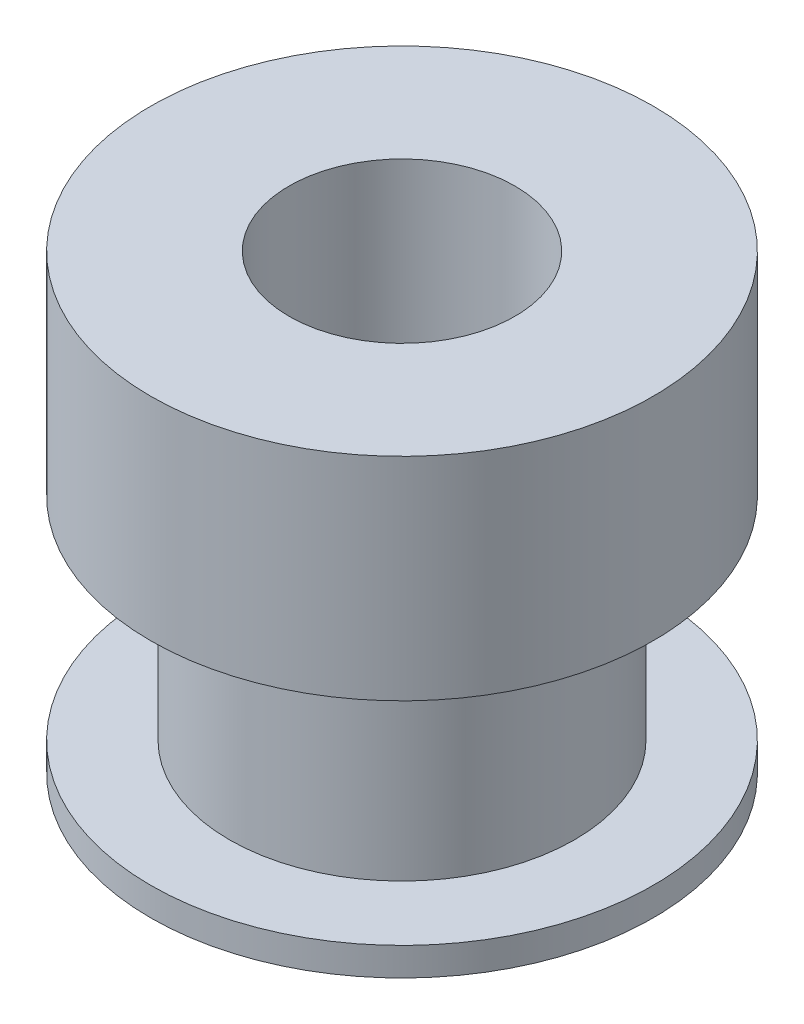
ISO-10303-21;
HEADER;
FILE_DESCRIPTION(('STEP AP214'),'2;1');
FILE_NAME('part.step','',(''),(''),'','','');
FILE_SCHEMA(('AUTOMOTIVE_DESIGN { 1 0 10303 214 1 1 1 1 }'));
ENDSEC;
DATA;
#1=APPLICATION_CONTEXT('core data for automotive mechanical design processes');
#2=APPLICATION_PROTOCOL_DEFINITION('international standard','automotive_design',2000,#1);
#3=PRODUCT_CONTEXT('',#1,'mechanical');
#4=PRODUCT('Part','Part','',(#3));
#5=PRODUCT_RELATED_PRODUCT_CATEGORY('part','',(#4));
#6=PRODUCT_DEFINITION_FORMATION('','',#4);
#7=PRODUCT_DEFINITION_CONTEXT('part definition',#1,'design');
#8=PRODUCT_DEFINITION('design','',#6,#7);
#9=PRODUCT_DEFINITION_SHAPE('','',#8);
#10=(LENGTH_UNIT() NAMED_UNIT(*) SI_UNIT(.MILLI.,.METRE.));
#11=(NAMED_UNIT(*) PLANE_ANGLE_UNIT() SI_UNIT($,.RADIAN.));
#12=(NAMED_UNIT(*) SI_UNIT($,.STERADIAN.) SOLID_ANGLE_UNIT());
#13=UNCERTAINTY_MEASURE_WITH_UNIT(LENGTH_MEASURE(1.E-05),#10,'distance_accuracy_value','');
#14=(GEOMETRIC_REPRESENTATION_CONTEXT(3) GLOBAL_UNCERTAINTY_ASSIGNED_CONTEXT((#13)) GLOBAL_UNIT_ASSIGNED_CONTEXT((#10,
#11,#12)) REPRESENTATION_CONTEXT('',''));
#15=CARTESIAN_POINT('',(0.,0.,0.));
#16=DIRECTION('',(0.,0.,1.));
#17=DIRECTION('',(1.,0.,0.));
#18=AXIS2_PLACEMENT_3D('',#15,#16,#17);
#19=CARTESIAN_POINT('',(0.,0.,0.));
#20=DIRECTION('',(0.,-1.,0.));
#21=DIRECTION('',(0.,0.,-1.));
#22=AXIS2_PLACEMENT_3D('',#19,#20,#21);
#23=CYLINDRICAL_SURFACE('',#22,4.);
#24=CARTESIAN_POINT('',(0.,0.,0.));
#25=DIRECTION('',(0.,-1.,0.));
#26=DIRECTION('',(0.,0.,-1.));
#27=AXIS2_PLACEMENT_3D('',#24,#25,#26);
#28=CIRCLE('',#27,4.);
#29=CARTESIAN_POINT('',(0.,0.,-4.));
#30=VERTEX_POINT('',#29);
#31=EDGE_CURVE('E10',#30,#30,#28,.T.);
#32=ORIENTED_EDGE('',*,*,#31,.T.);
#33=EDGE_LOOP('',(#32));
#34=FACE_BOUND('',#33,.T.);
#35=CARTESIAN_POINT('',(0.,16.,0.));
#36=DIRECTION('',(0.,-1.,0.));
#37=DIRECTION('',(0.,0.,-1.));
#38=AXIS2_PLACEMENT_3D('',#35,#36,#37);
#39=CIRCLE('',#38,4.);
#40=CARTESIAN_POINT('',(0.,16.,-4.));
#41=VERTEX_POINT('',#40);
#42=EDGE_CURVE('E58',#41,#41,#39,.T.);
#43=ORIENTED_EDGE('',*,*,#42,.F.);
#44=EDGE_LOOP('',(#43));
#45=FACE_BOUND('',#44,.T.);
#46=ADVANCED_FACE('F30',(#34,#45),#23,.F.);
#47=CARTESIAN_POINT('',(4.,0.,0.));
#48=DIRECTION('',(0.,-1.,0.));
#49=DIRECTION('',(0.,0.,-1.));
#50=AXIS2_PLACEMENT_3D('',#47,#48,#49);
#51=PLANE('',#50);
#52=CARTESIAN_POINT('',(0.,0.,0.));
#53=DIRECTION('',(0.,-1.,0.));
#54=DIRECTION('',(0.,0.,-1.));
#55=AXIS2_PLACEMENT_3D('',#52,#53,#54);
#56=CIRCLE('',#55,8.9);
#57=CARTESIAN_POINT('',(0.,0.,-8.9));
#58=VERTEX_POINT('',#57);
#59=EDGE_CURVE('E36',#58,#58,#56,.T.);
#60=ORIENTED_EDGE('',*,*,#59,.T.);
#61=EDGE_LOOP('',(#60));
#62=FACE_BOUND('',#61,.T.);
#63=ORIENTED_EDGE('',*,*,#31,.F.);
#64=EDGE_LOOP('',(#63));
#65=FACE_BOUND('',#64,.T.);
#66=ADVANCED_FACE('F66',(#62,#65),#51,.T.);
#67=CARTESIAN_POINT('',(0.,0.,0.));
#68=DIRECTION('',(0.,-1.,0.));
#69=DIRECTION('',(0.,0.,-1.));
#70=AXIS2_PLACEMENT_3D('',#67,#68,#69);
#71=CYLINDRICAL_SURFACE('',#70,8.9);
#72=CARTESIAN_POINT('',(0.,1.,0.));
#73=DIRECTION('',(0.,-1.,0.));
#74=DIRECTION('',(0.,0.,-1.));
#75=AXIS2_PLACEMENT_3D('',#72,#73,#74);
#76=CIRCLE('',#75,8.9);
#77=CARTESIAN_POINT('',(0.,1.,-8.9));
#78=VERTEX_POINT('',#77);
#79=EDGE_CURVE('E40',#78,#78,#76,.T.);
#80=ORIENTED_EDGE('',*,*,#79,.T.);
#81=EDGE_LOOP('',(#80));
#82=FACE_BOUND('',#81,.T.);
#83=ORIENTED_EDGE('',*,*,#59,.F.);
#84=EDGE_LOOP('',(#83));
#85=FACE_BOUND('',#84,.T.);
#86=ADVANCED_FACE('F70',(#82,#85),#71,.T.);
#87=CARTESIAN_POINT('',(8.9,1.,0.));
#88=DIRECTION('',(0.,1.,0.));
#89=DIRECTION('',(0.,0.,1.));
#90=AXIS2_PLACEMENT_3D('',#87,#88,#89);
#91=PLANE('',#90);
#92=CARTESIAN_POINT('',(0.,1.,0.));
#93=DIRECTION('',(0.,-1.,0.));
#94=DIRECTION('',(0.,0.,-1.));
#95=AXIS2_PLACEMENT_3D('',#92,#93,#94);
#96=CIRCLE('',#95,6.11);
#97=CARTESIAN_POINT('',(0.,1.,-6.11));
#98=VERTEX_POINT('',#97);
#99=EDGE_CURVE('E44',#98,#98,#96,.T.);
#100=ORIENTED_EDGE('',*,*,#99,.T.);
#101=EDGE_LOOP('',(#100));
#102=FACE_BOUND('',#101,.T.);
#103=ORIENTED_EDGE('',*,*,#79,.F.);
#104=EDGE_LOOP('',(#103));
#105=FACE_BOUND('',#104,.T.);
#106=ADVANCED_FACE('F74',(#102,#105),#91,.T.);
#107=CARTESIAN_POINT('',(0.,0.,0.));
#108=DIRECTION('',(0.,-1.,0.));
#109=DIRECTION('',(0.,0.,-1.));
#110=AXIS2_PLACEMENT_3D('',#107,#108,#109);
#111=CYLINDRICAL_SURFACE('',#110,6.11);
#112=CARTESIAN_POINT('',(0.,8.5,0.));
#113=DIRECTION('',(0.,-1.,0.));
#114=DIRECTION('',(0.,0.,-1.));
#115=AXIS2_PLACEMENT_3D('',#112,#113,#114);
#116=CIRCLE('',#115,6.11);
#117=CARTESIAN_POINT('',(0.,8.5,-6.11));
#118=VERTEX_POINT('',#117);
#119=EDGE_CURVE('E49',#118,#118,#116,.T.);
#120=ORIENTED_EDGE('',*,*,#119,.T.);
#121=EDGE_LOOP('',(#120));
#122=FACE_BOUND('',#121,.T.);
#123=ORIENTED_EDGE('',*,*,#99,.F.);
#124=EDGE_LOOP('',(#123));
#125=FACE_BOUND('',#124,.T.);
#126=ADVANCED_FACE('F81',(#122,#125),#111,.T.);
#127=CARTESIAN_POINT('',(6.11,8.5,0.));
#128=DIRECTION('',(0.,-1.,0.));
#129=DIRECTION('',(0.,0.,-1.));
#130=AXIS2_PLACEMENT_3D('',#127,#128,#129);
#131=PLANE('',#130);
#132=CARTESIAN_POINT('',(0.,8.5,0.));
#133=DIRECTION('',(0.,-1.,0.));
#134=DIRECTION('',(0.,0.,-1.));
#135=AXIS2_PLACEMENT_3D('',#132,#133,#134);
#136=CIRCLE('',#135,8.9);
#137=CARTESIAN_POINT('',(0.,8.5,-8.9));
#138=VERTEX_POINT('',#137);
#139=EDGE_CURVE('E52',#138,#138,#136,.T.);
#140=ORIENTED_EDGE('',*,*,#139,.T.);
#141=EDGE_LOOP('',(#140));
#142=FACE_BOUND('',#141,.T.);
#143=ORIENTED_EDGE('',*,*,#119,.F.);
#144=EDGE_LOOP('',(#143));
#145=FACE_BOUND('',#144,.T.);
#146=ADVANCED_FACE('F85',(#142,#145),#131,.T.);
#147=CARTESIAN_POINT('',(0.,0.,0.));
#148=DIRECTION('',(0.,-1.,0.));
#149=DIRECTION('',(0.,0.,-1.));
#150=AXIS2_PLACEMENT_3D('',#147,#148,#149);
#151=CYLINDRICAL_SURFACE('',#150,8.9);
#152=CARTESIAN_POINT('',(0.,16.,0.));
#153=DIRECTION('',(0.,-1.,0.));
#154=DIRECTION('',(0.,0.,-1.));
#155=AXIS2_PLACEMENT_3D('',#152,#153,#154);
#156=CIRCLE('',#155,8.9);
#157=CARTESIAN_POINT('',(0.,16.,-8.9));
#158=VERTEX_POINT('',#157);
#159=EDGE_CURVE('E55',#158,#158,#156,.T.);
#160=ORIENTED_EDGE('',*,*,#159,.T.);
#161=EDGE_LOOP('',(#160));
#162=FACE_BOUND('',#161,.T.);
#163=ORIENTED_EDGE('',*,*,#139,.F.);
#164=EDGE_LOOP('',(#163));
#165=FACE_BOUND('',#164,.T.);
#166=ADVANCED_FACE('F89',(#162,#165),#151,.T.);
#167=CARTESIAN_POINT('',(8.9,16.,0.));
#168=DIRECTION('',(0.,1.,0.));
#169=DIRECTION('',(0.,0.,1.));
#170=AXIS2_PLACEMENT_3D('',#167,#168,#169);
#171=PLANE('',#170);
#172=ORIENTED_EDGE('',*,*,#42,.T.);
#173=EDGE_LOOP('',(#172));
#174=FACE_BOUND('',#173,.T.);
#175=ORIENTED_EDGE('',*,*,#159,.F.);
#176=EDGE_LOOP('',(#175));
#177=FACE_BOUND('',#176,.T.);
#178=ADVANCED_FACE('F62',(#174,#177),#171,.T.);
#179=CLOSED_SHELL('',(#46,#66,#86,#106,#126,#146,#166,#178));
#180=MANIFOLD_SOLID_BREP('B2',#179);
#181=ADVANCED_BREP_SHAPE_REPRESENTATION('',(#18,#180),#14);
#182=SHAPE_DEFINITION_REPRESENTATION(#9,#181);
ENDSEC;
END-ISO-10303-21;
